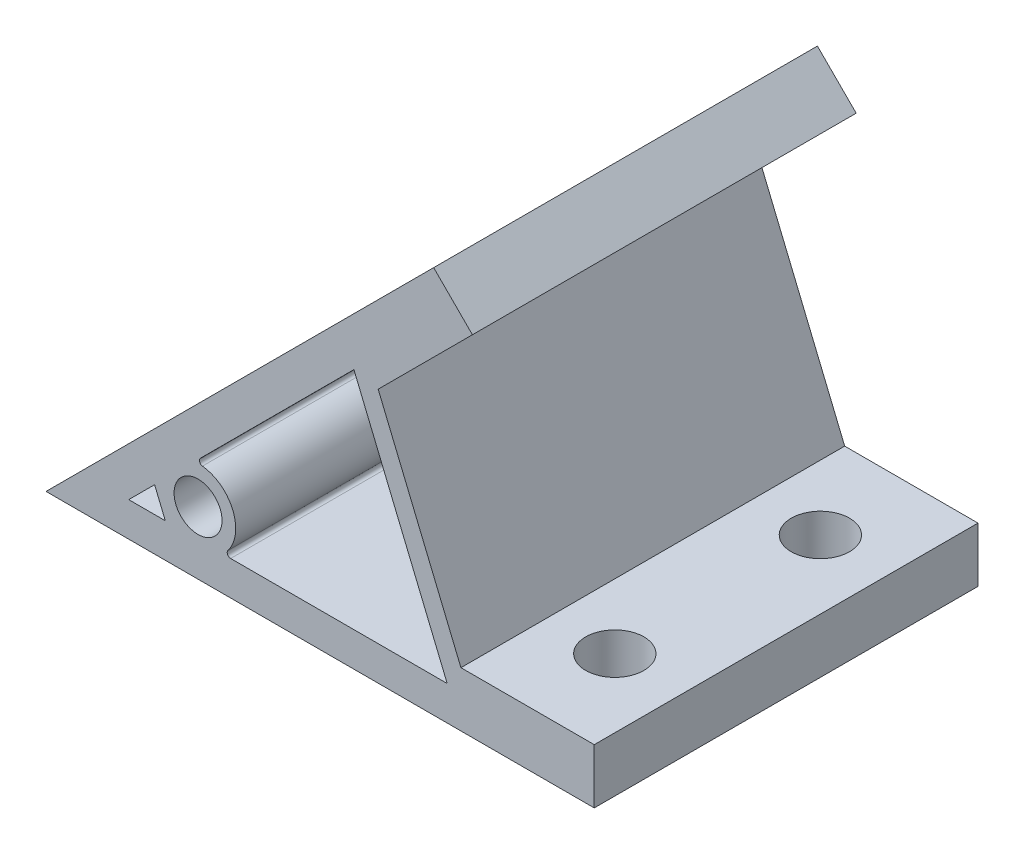
ISO-10303-21;
HEADER;
FILE_DESCRIPTION(('STEP AP214'),'2;1');
FILE_NAME('part.step','',(''),(''),'','','');
FILE_SCHEMA(('AUTOMOTIVE_DESIGN { 1 0 10303 214 1 1 1 1 }'));
ENDSEC;
DATA;
#1=APPLICATION_CONTEXT('core data for automotive mechanical design processes');
#2=APPLICATION_PROTOCOL_DEFINITION('international standard','automotive_design',2000,#1);
#3=PRODUCT_CONTEXT('',#1,'mechanical');
#4=PRODUCT('Part','Part','',(#3));
#5=PRODUCT_RELATED_PRODUCT_CATEGORY('part','',(#4));
#6=PRODUCT_DEFINITION_FORMATION('','',#4);
#7=PRODUCT_DEFINITION_CONTEXT('part definition',#1,'design');
#8=PRODUCT_DEFINITION('design','',#6,#7);
#9=PRODUCT_DEFINITION_SHAPE('','',#8);
#10=(LENGTH_UNIT() NAMED_UNIT(*) SI_UNIT(.MILLI.,.METRE.));
#11=(NAMED_UNIT(*) PLANE_ANGLE_UNIT() SI_UNIT($,.RADIAN.));
#12=(NAMED_UNIT(*) SI_UNIT($,.STERADIAN.) SOLID_ANGLE_UNIT());
#13=UNCERTAINTY_MEASURE_WITH_UNIT(LENGTH_MEASURE(1.E-05),#10,'distance_accuracy_value','');
#14=(GEOMETRIC_REPRESENTATION_CONTEXT(3) GLOBAL_UNCERTAINTY_ASSIGNED_CONTEXT((#13)) GLOBAL_UNIT_ASSIGNED_CONTEXT((#10,
#11,#12)) REPRESENTATION_CONTEXT('',''));
#15=CARTESIAN_POINT('',(0.,0.,0.));
#16=DIRECTION('',(0.,0.,1.));
#17=DIRECTION('',(1.,0.,0.));
#18=AXIS2_PLACEMENT_3D('',#15,#16,#17);
#19=CARTESIAN_POINT('',(48.4703535180654,37.1566450190806,28.));
#20=DIRECTION('',(-0.707106781186548,0.707106781186547,0.));
#21=DIRECTION('',(-0.707106781186547,-0.707106781186548,0.));
#22=AXIS2_PLACEMENT_3D('',#19,#20,#21);
#23=PLANE('',#22);
#24=CARTESIAN_POINT('',(55.1543289325507,43.840620433566,15.));
#25=DIRECTION('',(-0.707106781186548,0.707106781186547,0.));
#26=DIRECTION('',(-0.707106781186547,-0.707106781186548,0.));
#27=AXIS2_PLACEMENT_3D('',#24,#25,#26);
#28=CIRCLE('',#27,4.25);
#29=CARTESIAN_POINT('',(52.1491251125079,40.8354166135231,15.));
#30=VERTEX_POINT('',#29);
#31=EDGE_CURVE('E289',#30,#30,#28,.F.);
#32=ORIENTED_EDGE('',*,*,#31,.F.);
#33=EDGE_LOOP('',(#32));
#34=FACE_BOUND('',#33,.T.);
#35=DIRECTION('',(0.707106781186547,0.707106781186548,0.));
#36=VECTOR('',#35,1.);
#37=CARTESIAN_POINT('',(48.4703535180654,37.1566450190806,-28.));
#38=LINE('',#37,#36);
#39=CARTESIAN_POINT('',(48.4703535180654,37.1566450190806,-28.));
#40=VERTEX_POINT('',#39);
#41=CARTESIAN_POINT('',(62.2253967444162,50.9116882454314,-28.));
#42=VERTEX_POINT('',#41);
#43=EDGE_CURVE('E257',#40,#42,#38,.T.);
#44=ORIENTED_EDGE('',*,*,#43,.T.);
#45=DIRECTION('',(0.,0.,-1.));
#46=VECTOR('',#45,1.);
#47=CARTESIAN_POINT('',(62.2253967444162,50.9116882454314,28.));
#48=LINE('',#47,#46);
#49=CARTESIAN_POINT('',(62.2253967444162,50.9116882454314,28.));
#50=VERTEX_POINT('',#49);
#51=EDGE_CURVE('E267',#50,#42,#48,.T.);
#52=ORIENTED_EDGE('',*,*,#51,.F.);
#53=DIRECTION('',(0.707106781186547,0.707106781186548,0.));
#54=VECTOR('',#53,1.);
#55=CARTESIAN_POINT('',(48.4703535180654,37.1566450190806,28.));
#56=LINE('',#55,#54);
#57=CARTESIAN_POINT('',(48.4703535180654,37.1566450190806,28.));
#58=VERTEX_POINT('',#57);
#59=EDGE_CURVE('E242',#58,#50,#56,.T.);
#60=ORIENTED_EDGE('',*,*,#59,.F.);
#61=DIRECTION('',(0.,0.,-1.));
#62=VECTOR('',#61,1.);
#63=CARTESIAN_POINT('',(48.4703535180654,37.1566450190806,28.));
#64=LINE('',#63,#62);
#65=EDGE_CURVE('E270',#58,#40,#64,.T.);
#66=ORIENTED_EDGE('',*,*,#65,.T.);
#67=EDGE_LOOP('',(#44,#52,#60,#66));
#68=FACE_BOUND('',#67,.T.);
#69=CARTESIAN_POINT('',(55.1543289325507,43.840620433566,-15.));
#70=DIRECTION('',(-0.707106781186548,0.707106781186547,0.));
#71=DIRECTION('',(-0.707106781186547,-0.707106781186548,0.));
#72=AXIS2_PLACEMENT_3D('',#69,#70,#71);
#73=CIRCLE('',#72,4.25000000000001);
#74=CARTESIAN_POINT('',(52.1491251125079,40.8354166135231,-15.));
#75=VERTEX_POINT('',#74);
#76=EDGE_CURVE('E295',#75,#75,#73,.F.);
#77=ORIENTED_EDGE('',*,*,#76,.F.);
#78=EDGE_LOOP('',(#77));
#79=FACE_BOUND('',#78,.T.);
#80=ADVANCED_FACE('F33',(#34,#68,#79),#23,.F.);
#81=CARTESIAN_POINT('',(0.,0.,28.));
#82=DIRECTION('',(0.707106781186549,-0.707106781186546,0.));
#83=DIRECTION('',(0.707106781186546,0.707106781186549,0.));
#84=AXIS2_PLACEMENT_3D('',#81,#82,#83);
#85=PLANE('',#84);
#86=CARTESIAN_POINT('',(49.4974746830583,49.4974746830584,15.));
#87=DIRECTION('',(0.707106781186548,-0.707106781186547,0.));
#88=DIRECTION('',(0.,0.,-1.));
#89=AXIS2_PLACEMENT_3D('',#86,#87,#88);
#90=CIRCLE('',#89,4.25);
#91=CARTESIAN_POINT('',(49.4974746830583,49.4974746830584,10.75));
#92=VERTEX_POINT('',#91);
#93=EDGE_CURVE('E292',#92,#92,#90,.T.);
#94=ORIENTED_EDGE('',*,*,#93,.T.);
#95=EDGE_LOOP('',(#94));
#96=FACE_BOUND('',#95,.T.);
#97=DIRECTION('',(-0.707106781186546,-0.707106781186549,0.));
#98=VECTOR('',#97,1.);
#99=CARTESIAN_POINT('',(0.,0.,-28.));
#100=LINE('',#99,#98);
#101=CARTESIAN_POINT('',(56.5685424949237,56.5685424949239,-28.));
#102=VERTEX_POINT('',#101);
#103=CARTESIAN_POINT('',(0.,0.,-28.));
#104=VERTEX_POINT('',#103);
#105=EDGE_CURVE('E236',#102,#104,#100,.T.);
#106=ORIENTED_EDGE('',*,*,#105,.T.);
#107=DIRECTION('',(0.,0.,-1.));
#108=VECTOR('',#107,1.);
#109=CARTESIAN_POINT('',(0.,0.,28.));
#110=LINE('',#109,#108);
#111=CARTESIAN_POINT('',(0.,0.,28.));
#112=VERTEX_POINT('',#111);
#113=EDGE_CURVE('E248',#112,#104,#110,.T.);
#114=ORIENTED_EDGE('',*,*,#113,.F.);
#115=DIRECTION('',(-0.707106781186546,-0.707106781186549,0.));
#116=VECTOR('',#115,1.);
#117=CARTESIAN_POINT('',(0.,0.,28.));
#118=LINE('',#117,#116);
#119=CARTESIAN_POINT('',(56.5685424949237,56.5685424949239,28.));
#120=VERTEX_POINT('',#119);
#121=EDGE_CURVE('E246',#120,#112,#118,.T.);
#122=ORIENTED_EDGE('',*,*,#121,.F.);
#123=DIRECTION('',(0.,0.,-1.));
#124=VECTOR('',#123,1.);
#125=CARTESIAN_POINT('',(56.5685424949237,56.5685424949239,28.));
#126=LINE('',#125,#124);
#127=EDGE_CURVE('E264',#120,#102,#126,.T.);
#128=ORIENTED_EDGE('',*,*,#127,.T.);
#129=EDGE_LOOP('',(#106,#114,#122,#128));
#130=FACE_BOUND('',#129,.T.);
#131=CARTESIAN_POINT('',(49.4974746830583,49.4974746830584,-15.));
#132=DIRECTION('',(0.707106781186548,-0.707106781186547,0.));
#133=DIRECTION('',(0.,0.,1.));
#134=AXIS2_PLACEMENT_3D('',#131,#132,#133);
#135=CIRCLE('',#134,4.25000000000001);
#136=CARTESIAN_POINT('',(49.4974746830583,49.4974746830584,-10.75));
#137=VERTEX_POINT('',#136);
#138=EDGE_CURVE('E298',#137,#137,#135,.T.);
#139=ORIENTED_EDGE('',*,*,#138,.T.);
#140=EDGE_LOOP('',(#139));
#141=FACE_BOUND('',#140,.T.);
#142=ADVANCED_FACE('F302',(#96,#130,#141),#85,.F.);
#143=CARTESIAN_POINT('',(80.,0.,28.));
#144=DIRECTION('',(0.,0.,1.));
#145=DIRECTION('',(1.,0.,0.));
#146=AXIS2_PLACEMENT_3D('',#143,#144,#145);
#147=PLANE('',#146);
#148=CARTESIAN_POINT('',(22.1846771867485,9.15647377294881,28.));
#149=DIRECTION('',(0.,0.,1.));
#150=DIRECTION('',(1.,0.,0.));
#151=AXIS2_PLACEMENT_3D('',#148,#149,#150);
#152=CIRCLE('',#151,3.5);
#153=CARTESIAN_POINT('',(25.6846771867485,9.15647377294881,28.));
#154=VERTEX_POINT('',#153);
#155=EDGE_CURVE('E202',#154,#154,#152,.T.);
#156=ORIENTED_EDGE('',*,*,#155,.F.);
#157=EDGE_LOOP('',(#156));
#158=FACE_BOUND('',#157,.T.);
#159=DIRECTION('',(1.,0.,0.));
#160=VECTOR('',#159,1.);
#161=CARTESIAN_POINT('',(0.,0.,28.));
#162=LINE('',#161,#160);
#163=CARTESIAN_POINT('',(80.,0.,28.));
#164=VERTEX_POINT('',#163);
#165=EDGE_CURVE('E232',#112,#164,#162,.T.);
#166=ORIENTED_EDGE('',*,*,#165,.T.);
#167=DIRECTION('',(0.,1.,0.));
#168=VECTOR('',#167,1.);
#169=CARTESIAN_POINT('',(80.,0.,28.));
#170=LINE('',#169,#168);
#171=CARTESIAN_POINT('',(80.,8.,28.));
#172=VERTEX_POINT('',#171);
#173=EDGE_CURVE('E235',#164,#172,#170,.T.);
#174=ORIENTED_EDGE('',*,*,#173,.T.);
#175=DIRECTION('',(-1.,0.,0.));
#176=VECTOR('',#175,1.);
#177=CARTESIAN_POINT('',(60.5474313182664,8.,28.));
#178=LINE('',#177,#176);
#179=CARTESIAN_POINT('',(60.5474313182664,8.,28.));
#180=VERTEX_POINT('',#179);
#181=EDGE_CURVE('E238',#172,#180,#178,.T.);
#182=ORIENTED_EDGE('',*,*,#181,.T.);
#183=DIRECTION('',(-0.382683432365087,0.923879532511288,0.));
#184=VECTOR('',#183,1.);
#185=CARTESIAN_POINT('',(60.5474313182664,8.,28.));
#186=LINE('',#185,#184);
#187=EDGE_CURVE('E240',#180,#58,#186,.T.);
#188=ORIENTED_EDGE('',*,*,#187,.T.);
#189=ORIENTED_EDGE('',*,*,#59,.T.);
#190=DIRECTION('',(-0.707106781186549,0.707106781186546,0.));
#191=VECTOR('',#190,1.);
#192=CARTESIAN_POINT('',(62.2253967444162,50.9116882454314,28.));
#193=LINE('',#192,#191);
#194=EDGE_CURVE('E244',#50,#120,#193,.T.);
#195=ORIENTED_EDGE('',*,*,#194,.T.);
#196=ORIENTED_EDGE('',*,*,#121,.T.);
#197=EDGE_LOOP('',(#166,#174,#182,#188,#189,#195,#196));
#198=FACE_BOUND('',#197,.T.);
#199=DIRECTION('',(-0.382683432365087,0.923879532511288,0.));
#200=VECTOR('',#199,1.);
#201=CARTESIAN_POINT('',(15.8476713770087,8.77660356514327,28.));
#202=LINE('',#201,#200);
#203=CARTESIAN_POINT('',(17.4119917933976,5.,28.));
#204=VERTEX_POINT('',#203);
#205=CARTESIAN_POINT('',(15.8476713770087,8.77660356514326,28.));
#206=VERTEX_POINT('',#205);
#207=EDGE_CURVE('E210',#204,#206,#202,.T.);
#208=ORIENTED_EDGE('',*,*,#207,.F.);
#209=DIRECTION('',(1.,0.,0.));
#210=VECTOR('',#209,1.);
#211=CARTESIAN_POINT('',(12.0710678118655,5.,28.));
#212=LINE('',#211,#210);
#213=CARTESIAN_POINT('',(12.0710678118655,5.,28.));
#214=VERTEX_POINT('',#213);
#215=EDGE_CURVE('E208',#214,#204,#212,.T.);
#216=ORIENTED_EDGE('',*,*,#215,.F.);
#217=DIRECTION('',(-0.707106781186543,-0.707106781186552,0.));
#218=VECTOR('',#217,1.);
#219=CARTESIAN_POINT('',(12.0710678118655,5.,28.));
#220=LINE('',#219,#218);
#221=EDGE_CURVE('E214',#206,#214,#220,.T.);
#222=ORIENTED_EDGE('',*,*,#221,.F.);
#223=EDGE_LOOP('',(#208,#216,#222));
#224=FACE_BOUND('',#223,.T.);
#225=DIRECTION('',(1.,0.,0.));
#226=VECTOR('',#225,1.);
#227=CARTESIAN_POINT('',(26.9417981172838,5.,28.));
#228=LINE('',#227,#226);
#229=CARTESIAN_POINT('',(26.9417981172838,5.,28.));
#230=VERTEX_POINT('',#229);
#231=CARTESIAN_POINT('',(58.5428954045085,5.,28.));
#232=VERTEX_POINT('',#231);
#233=EDGE_CURVE('E156',#230,#232,#228,.T.);
#234=ORIENTED_EDGE('',*,*,#233,.F.);
#235=CARTESIAN_POINT('',(26.9417981172838,5.5,28.));
#236=DIRECTION('',(0.,0.,1.));
#237=DIRECTION('',(-1.,0.,0.));
#238=AXIS2_PLACEMENT_3D('',#235,#236,#237);
#239=CIRCLE('',#238,0.5);
#240=CARTESIAN_POINT('',(26.5453713730726,5.80470614774571,28.));
#241=VERTEX_POINT('',#240);
#242=EDGE_CURVE('E148',#241,#230,#239,.T.);
#243=ORIENTED_EDGE('',*,*,#242,.F.);
#244=CARTESIAN_POINT('',(22.1846771867485,9.15647377294881,28.));
#245=DIRECTION('',(0.,0.,-1.));
#246=DIRECTION('',(1.,0.,0.));
#247=AXIS2_PLACEMENT_3D('',#244,#245,#246);
#248=CIRCLE('',#247,5.5);
#249=CARTESIAN_POINT('',(22.8337204048437,14.6180434100627,28.));
#250=VERTEX_POINT('',#249);
#251=EDGE_CURVE('E179',#250,#241,#248,.T.);
#252=ORIENTED_EDGE('',*,*,#251,.F.);
#253=CARTESIAN_POINT('',(22.8927243337614,15.1145497407095,28.));
#254=DIRECTION('',(0.,0.,1.));
#255=DIRECTION('',(1.,0.,0.));
#256=AXIS2_PLACEMENT_3D('',#253,#254,#255);
#257=CIRCLE('',#256,0.500000000000001);
#258=CARTESIAN_POINT('',(22.5391709431682,15.4681031313028,28.));
#259=VERTEX_POINT('',#258);
#260=EDGE_CURVE('E177',#259,#250,#257,.T.);
#261=ORIENTED_EDGE('',*,*,#260,.F.);
#262=DIRECTION('',(-0.707106781186546,-0.707106781186549,0.));
#263=VECTOR('',#262,1.);
#264=CARTESIAN_POINT('',(22.5391709431682,15.4681031313028,28.));
#265=LINE('',#264,#263);
#266=CARTESIAN_POINT('',(44.9316122367555,37.8605444248902,28.));
#267=VERTEX_POINT('',#266);
#268=EDGE_CURVE('E172',#267,#259,#265,.T.);
#269=ORIENTED_EDGE('',*,*,#268,.F.);
#270=DIRECTION('',(-0.382683432365087,0.923879532511288,0.));
#271=VECTOR('',#270,1.);
#272=CARTESIAN_POINT('',(58.5428954045085,5.,28.));
#273=LINE('',#272,#271);
#274=EDGE_CURVE('E170',#232,#267,#273,.T.);
#275=ORIENTED_EDGE('',*,*,#274,.F.);
#276=EDGE_LOOP('',(#234,#243,#252,#261,#269,#275));
#277=FACE_BOUND('',#276,.T.);
#278=ADVANCED_FACE('F168',(#158,#198,#224,#277),#147,.T.);
#279=CARTESIAN_POINT('',(80.,0.,-28.));
#280=DIRECTION('',(0.,0.,1.));
#281=DIRECTION('',(1.,0.,0.));
#282=AXIS2_PLACEMENT_3D('',#279,#280,#281);
#283=PLANE('',#282);
#284=CARTESIAN_POINT('',(22.1846771867485,9.15647377294881,-28.));
#285=DIRECTION('',(0.,0.,1.));
#286=DIRECTION('',(1.,0.,0.));
#287=AXIS2_PLACEMENT_3D('',#284,#285,#286);
#288=CIRCLE('',#287,3.5);
#289=CARTESIAN_POINT('',(25.6846771867485,9.15647377294881,-28.));
#290=VERTEX_POINT('',#289);
#291=EDGE_CURVE('E164',#290,#290,#288,.T.);
#292=ORIENTED_EDGE('',*,*,#291,.T.);
#293=EDGE_LOOP('',(#292));
#294=FACE_BOUND('',#293,.T.);
#295=DIRECTION('',(1.,0.,0.));
#296=VECTOR('',#295,1.);
#297=CARTESIAN_POINT('',(0.,0.,-28.));
#298=LINE('',#297,#296);
#299=CARTESIAN_POINT('',(80.,0.,-28.));
#300=VERTEX_POINT('',#299);
#301=EDGE_CURVE('E231',#104,#300,#298,.T.);
#302=ORIENTED_EDGE('',*,*,#301,.F.);
#303=ORIENTED_EDGE('',*,*,#105,.F.);
#304=DIRECTION('',(-0.707106781186549,0.707106781186546,0.));
#305=VECTOR('',#304,1.);
#306=CARTESIAN_POINT('',(62.2253967444162,50.9116882454314,-28.));
#307=LINE('',#306,#305);
#308=EDGE_CURVE('E259',#42,#102,#307,.T.);
#309=ORIENTED_EDGE('',*,*,#308,.F.);
#310=ORIENTED_EDGE('',*,*,#43,.F.);
#311=DIRECTION('',(-0.382683432365087,0.923879532511288,0.));
#312=VECTOR('',#311,1.);
#313=CARTESIAN_POINT('',(60.5474313182664,8.,-28.));
#314=LINE('',#313,#312);
#315=CARTESIAN_POINT('',(60.5474313182664,8.,-28.));
#316=VERTEX_POINT('',#315);
#317=EDGE_CURVE('E255',#316,#40,#314,.T.);
#318=ORIENTED_EDGE('',*,*,#317,.F.);
#319=DIRECTION('',(-1.,0.,0.));
#320=VECTOR('',#319,1.);
#321=CARTESIAN_POINT('',(60.5474313182664,8.,-28.));
#322=LINE('',#321,#320);
#323=CARTESIAN_POINT('',(80.,8.,-28.));
#324=VERTEX_POINT('',#323);
#325=EDGE_CURVE('E253',#324,#316,#322,.T.);
#326=ORIENTED_EDGE('',*,*,#325,.F.);
#327=DIRECTION('',(0.,1.,0.));
#328=VECTOR('',#327,1.);
#329=CARTESIAN_POINT('',(80.,0.,-28.));
#330=LINE('',#329,#328);
#331=EDGE_CURVE('E251',#300,#324,#330,.T.);
#332=ORIENTED_EDGE('',*,*,#331,.F.);
#333=EDGE_LOOP('',(#302,#303,#309,#310,#318,#326,#332));
#334=FACE_BOUND('',#333,.T.);
#335=DIRECTION('',(1.,0.,0.));
#336=VECTOR('',#335,1.);
#337=CARTESIAN_POINT('',(12.0710678118655,5.,-28.));
#338=LINE('',#337,#336);
#339=CARTESIAN_POINT('',(12.0710678118655,5.,-28.));
#340=VERTEX_POINT('',#339);
#341=CARTESIAN_POINT('',(17.4119917933976,5.,-28.));
#342=VERTEX_POINT('',#341);
#343=EDGE_CURVE('E205',#340,#342,#338,.T.);
#344=ORIENTED_EDGE('',*,*,#343,.T.);
#345=DIRECTION('',(-0.382683432365087,0.923879532511288,0.));
#346=VECTOR('',#345,1.);
#347=CARTESIAN_POINT('',(15.8476713770087,8.77660356514327,-28.));
#348=LINE('',#347,#346);
#349=CARTESIAN_POINT('',(15.8476713770087,8.77660356514327,-28.));
#350=VERTEX_POINT('',#349);
#351=EDGE_CURVE('E219',#342,#350,#348,.T.);
#352=ORIENTED_EDGE('',*,*,#351,.T.);
#353=DIRECTION('',(-0.707106781186543,-0.707106781186552,0.));
#354=VECTOR('',#353,1.);
#355=CARTESIAN_POINT('',(12.0710678118655,5.,-28.));
#356=LINE('',#355,#354);
#357=EDGE_CURVE('E211',#350,#340,#356,.T.);
#358=ORIENTED_EDGE('',*,*,#357,.T.);
#359=EDGE_LOOP('',(#344,#352,#358));
#360=FACE_BOUND('',#359,.T.);
#361=CARTESIAN_POINT('',(26.9417981172838,5.5,-28.));
#362=DIRECTION('',(0.,0.,1.));
#363=DIRECTION('',(-1.,0.,0.));
#364=AXIS2_PLACEMENT_3D('',#361,#362,#363);
#365=CIRCLE('',#364,0.5);
#366=CARTESIAN_POINT('',(26.5453713730726,5.8047061477457,-28.));
#367=VERTEX_POINT('',#366);
#368=CARTESIAN_POINT('',(26.9417981172838,5.,-28.));
#369=VERTEX_POINT('',#368);
#370=EDGE_CURVE('E58',#367,#369,#365,.T.);
#371=ORIENTED_EDGE('',*,*,#370,.T.);
#372=DIRECTION('',(1.,0.,0.));
#373=VECTOR('',#372,1.);
#374=CARTESIAN_POINT('',(26.9417981172838,5.,-28.));
#375=LINE('',#374,#373);
#376=CARTESIAN_POINT('',(58.5428954045085,5.,-28.));
#377=VERTEX_POINT('',#376);
#378=EDGE_CURVE('E163',#369,#377,#375,.T.);
#379=ORIENTED_EDGE('',*,*,#378,.T.);
#380=DIRECTION('',(-0.382683432365087,0.923879532511288,0.));
#381=VECTOR('',#380,1.);
#382=CARTESIAN_POINT('',(58.5428954045085,5.,-28.));
#383=LINE('',#382,#381);
#384=CARTESIAN_POINT('',(44.9316122367555,37.8605444248902,-28.));
#385=VERTEX_POINT('',#384);
#386=EDGE_CURVE('E184',#377,#385,#383,.T.);
#387=ORIENTED_EDGE('',*,*,#386,.T.);
#388=DIRECTION('',(-0.707106781186546,-0.707106781186549,0.));
#389=VECTOR('',#388,1.);
#390=CARTESIAN_POINT('',(22.5391709431682,15.4681031313028,-28.));
#391=LINE('',#390,#389);
#392=CARTESIAN_POINT('',(22.5391709431682,15.4681031313028,-28.));
#393=VERTEX_POINT('',#392);
#394=EDGE_CURVE('E187',#385,#393,#391,.T.);
#395=ORIENTED_EDGE('',*,*,#394,.T.);
#396=CARTESIAN_POINT('',(22.8927243337614,15.1145497407095,-28.));
#397=DIRECTION('',(0.,0.,1.));
#398=DIRECTION('',(1.,0.,0.));
#399=AXIS2_PLACEMENT_3D('',#396,#397,#398);
#400=CIRCLE('',#399,0.500000000000001);
#401=CARTESIAN_POINT('',(22.8337204048437,14.6180434100628,-28.));
#402=VERTEX_POINT('',#401);
#403=EDGE_CURVE('E190',#393,#402,#400,.T.);
#404=ORIENTED_EDGE('',*,*,#403,.T.);
#405=CARTESIAN_POINT('',(22.1846771867485,9.15647377294881,-28.));
#406=DIRECTION('',(0.,0.,-1.));
#407=DIRECTION('',(1.,0.,0.));
#408=AXIS2_PLACEMENT_3D('',#405,#406,#407);
#409=CIRCLE('',#408,5.5);
#410=EDGE_CURVE('E157',#402,#367,#409,.T.);
#411=ORIENTED_EDGE('',*,*,#410,.T.);
#412=EDGE_LOOP('',(#371,#379,#387,#395,#404,#411));
#413=FACE_BOUND('',#412,.T.);
#414=ADVANCED_FACE('F337',(#294,#334,#360,#413),#283,.F.);
#415=CARTESIAN_POINT('',(0.,0.,28.));
#416=DIRECTION('',(0.,1.,0.));
#417=DIRECTION('',(0.,0.,1.));
#418=AXIS2_PLACEMENT_3D('',#415,#416,#417);
#419=PLANE('',#418);
#420=CARTESIAN_POINT('',(70.,0.,-15.));
#421=DIRECTION('',(0.,-1.,0.));
#422=DIRECTION('',(0.,0.,1.));
#423=AXIS2_PLACEMENT_3D('',#420,#421,#422);
#424=CIRCLE('',#423,4.25000000000001);
#425=CARTESIAN_POINT('',(70.,0.,-10.75));
#426=VERTEX_POINT('',#425);
#427=EDGE_CURVE('E285',#426,#426,#424,.T.);
#428=ORIENTED_EDGE('',*,*,#427,.F.);
#429=EDGE_LOOP('',(#428));
#430=FACE_BOUND('',#429,.T.);
#431=CARTESIAN_POINT('',(70.,0.,15.));
#432=DIRECTION('',(0.,-1.,0.));
#433=DIRECTION('',(0.,0.,-1.));
#434=AXIS2_PLACEMENT_3D('',#431,#432,#433);
#435=CIRCLE('',#434,4.25);
#436=CARTESIAN_POINT('',(70.,0.,10.75));
#437=VERTEX_POINT('',#436);
#438=EDGE_CURVE('E278',#437,#437,#435,.T.);
#439=ORIENTED_EDGE('',*,*,#438,.F.);
#440=EDGE_LOOP('',(#439));
#441=FACE_BOUND('',#440,.T.);
#442=ORIENTED_EDGE('',*,*,#301,.T.);
#443=DIRECTION('',(0.,0.,-1.));
#444=VECTOR('',#443,1.);
#445=CARTESIAN_POINT('',(80.,0.,28.));
#446=LINE('',#445,#444);
#447=EDGE_CURVE('E11',#164,#300,#446,.T.);
#448=ORIENTED_EDGE('',*,*,#447,.F.);
#449=ORIENTED_EDGE('',*,*,#165,.F.);
#450=ORIENTED_EDGE('',*,*,#113,.T.);
#451=EDGE_LOOP('',(#442,#448,#449,#450));
#452=FACE_BOUND('',#451,.T.);
#453=ADVANCED_FACE('F35',(#430,#441,#452),#419,.F.);
#454=CARTESIAN_POINT('',(80.,0.,28.));
#455=DIRECTION('',(-1.,0.,0.));
#456=DIRECTION('',(0.,0.,1.));
#457=AXIS2_PLACEMENT_3D('',#454,#455,#456);
#458=PLANE('',#457);
#459=ORIENTED_EDGE('',*,*,#331,.T.);
#460=DIRECTION('',(0.,0.,-1.));
#461=VECTOR('',#460,1.);
#462=CARTESIAN_POINT('',(80.,8.,28.));
#463=LINE('',#462,#461);
#464=EDGE_CURVE('E42',#172,#324,#463,.T.);
#465=ORIENTED_EDGE('',*,*,#464,.F.);
#466=ORIENTED_EDGE('',*,*,#173,.F.);
#467=ORIENTED_EDGE('',*,*,#447,.T.);
#468=EDGE_LOOP('',(#459,#465,#466,#467));
#469=FACE_BOUND('',#468,.T.);
#470=ADVANCED_FACE('F330',(#469),#458,.F.);
#471=CARTESIAN_POINT('',(60.5474313182664,8.,28.));
#472=DIRECTION('',(0.,-1.,0.));
#473=DIRECTION('',(0.,0.,-1.));
#474=AXIS2_PLACEMENT_3D('',#471,#472,#473);
#475=PLANE('',#474);
#476=CARTESIAN_POINT('',(70.,8.,-15.));
#477=DIRECTION('',(0.,-1.,0.));
#478=DIRECTION('',(0.,0.,-1.));
#479=AXIS2_PLACEMENT_3D('',#476,#477,#478);
#480=CIRCLE('',#479,4.25000000000001);
#481=CARTESIAN_POINT('',(70.,8.,-19.25));
#482=VERTEX_POINT('',#481);
#483=EDGE_CURVE('E37',#482,#482,#480,.T.);
#484=ORIENTED_EDGE('',*,*,#483,.T.);
#485=EDGE_LOOP('',(#484));
#486=FACE_BOUND('',#485,.T.);
#487=CARTESIAN_POINT('',(70.,8.,15.));
#488=DIRECTION('',(0.,-1.,0.));
#489=DIRECTION('',(0.,0.,-1.));
#490=AXIS2_PLACEMENT_3D('',#487,#488,#489);
#491=CIRCLE('',#490,4.25);
#492=CARTESIAN_POINT('',(70.,8.,10.75));
#493=VERTEX_POINT('',#492);
#494=EDGE_CURVE('E182',#493,#493,#491,.T.);
#495=ORIENTED_EDGE('',*,*,#494,.T.);
#496=EDGE_LOOP('',(#495));
#497=FACE_BOUND('',#496,.T.);
#498=ORIENTED_EDGE('',*,*,#325,.T.);
#499=DIRECTION('',(0.,0.,-1.));
#500=VECTOR('',#499,1.);
#501=CARTESIAN_POINT('',(60.5474313182664,8.,28.));
#502=LINE('',#501,#500);
#503=EDGE_CURVE('E273',#180,#316,#502,.T.);
#504=ORIENTED_EDGE('',*,*,#503,.F.);
#505=ORIENTED_EDGE('',*,*,#181,.F.);
#506=ORIENTED_EDGE('',*,*,#464,.T.);
#507=EDGE_LOOP('',(#498,#504,#505,#506));
#508=FACE_BOUND('',#507,.T.);
#509=ADVANCED_FACE('F327',(#486,#497,#508),#475,.F.);
#510=CARTESIAN_POINT('',(60.5474313182664,8.,28.));
#511=DIRECTION('',(-0.923879532511288,-0.382683432365087,0.));
#512=DIRECTION('',(0.382683432365087,-0.923879532511288,0.));
#513=AXIS2_PLACEMENT_3D('',#510,#511,#512);
#514=PLANE('',#513);
#515=ORIENTED_EDGE('',*,*,#317,.T.);
#516=ORIENTED_EDGE('',*,*,#65,.F.);
#517=ORIENTED_EDGE('',*,*,#187,.F.);
#518=ORIENTED_EDGE('',*,*,#503,.T.);
#519=EDGE_LOOP('',(#515,#516,#517,#518));
#520=FACE_BOUND('',#519,.T.);
#521=ADVANCED_FACE('F324',(#520),#514,.F.);
#522=CARTESIAN_POINT('',(62.2253967444162,50.9116882454314,28.));
#523=DIRECTION('',(-0.707106781186546,-0.707106781186549,0.));
#524=DIRECTION('',(0.707106781186549,-0.707106781186546,0.));
#525=AXIS2_PLACEMENT_3D('',#522,#523,#524);
#526=PLANE('',#525);
#527=ORIENTED_EDGE('',*,*,#308,.T.);
#528=ORIENTED_EDGE('',*,*,#127,.F.);
#529=ORIENTED_EDGE('',*,*,#194,.F.);
#530=ORIENTED_EDGE('',*,*,#51,.T.);
#531=EDGE_LOOP('',(#527,#528,#529,#530));
#532=FACE_BOUND('',#531,.T.);
#533=ADVANCED_FACE('F323',(#532),#526,.F.);
#534=CARTESIAN_POINT('',(12.0710678118655,5.,28.));
#535=DIRECTION('',(0.,1.,0.));
#536=DIRECTION('',(0.,0.,1.));
#537=AXIS2_PLACEMENT_3D('',#534,#535,#536);
#538=PLANE('',#537);
#539=ORIENTED_EDGE('',*,*,#343,.F.);
#540=DIRECTION('',(0.,0.,-1.));
#541=VECTOR('',#540,1.);
#542=CARTESIAN_POINT('',(12.0710678118655,5.,28.));
#543=LINE('',#542,#541);
#544=EDGE_CURVE('E216',#214,#340,#543,.T.);
#545=ORIENTED_EDGE('',*,*,#544,.F.);
#546=ORIENTED_EDGE('',*,*,#215,.T.);
#547=DIRECTION('',(0.,0.,-1.));
#548=VECTOR('',#547,1.);
#549=CARTESIAN_POINT('',(17.4119917933976,5.,28.));
#550=LINE('',#549,#548);
#551=EDGE_CURVE('E228',#204,#342,#550,.T.);
#552=ORIENTED_EDGE('',*,*,#551,.T.);
#553=EDGE_LOOP('',(#539,#545,#546,#552));
#554=FACE_BOUND('',#553,.T.);
#555=ADVANCED_FACE('F367',(#554),#538,.T.);
#556=CARTESIAN_POINT('',(15.8476713770087,8.77660356514327,28.));
#557=DIRECTION('',(-0.923879532511288,-0.382683432365087,0.));
#558=DIRECTION('',(0.382683432365087,-0.923879532511288,0.));
#559=AXIS2_PLACEMENT_3D('',#556,#557,#558);
#560=PLANE('',#559);
#561=ORIENTED_EDGE('',*,*,#351,.F.);
#562=ORIENTED_EDGE('',*,*,#551,.F.);
#563=ORIENTED_EDGE('',*,*,#207,.T.);
#564=DIRECTION('',(0.,0.,-1.));
#565=VECTOR('',#564,1.);
#566=CARTESIAN_POINT('',(15.8476713770087,8.77660356514327,28.));
#567=LINE('',#566,#565);
#568=EDGE_CURVE('E226',#206,#350,#567,.T.);
#569=ORIENTED_EDGE('',*,*,#568,.T.);
#570=EDGE_LOOP('',(#561,#562,#563,#569));
#571=FACE_BOUND('',#570,.T.);
#572=ADVANCED_FACE('F371',(#571),#560,.T.);
#573=CARTESIAN_POINT('',(12.0710678118655,5.,28.));
#574=DIRECTION('',(0.707106781186552,-0.707106781186543,0.));
#575=DIRECTION('',(0.707106781186543,0.707106781186552,0.));
#576=AXIS2_PLACEMENT_3D('',#573,#574,#575);
#577=PLANE('',#576);
#578=ORIENTED_EDGE('',*,*,#357,.F.);
#579=ORIENTED_EDGE('',*,*,#568,.F.);
#580=ORIENTED_EDGE('',*,*,#221,.T.);
#581=ORIENTED_EDGE('',*,*,#544,.T.);
#582=EDGE_LOOP('',(#578,#579,#580,#581));
#583=FACE_BOUND('',#582,.T.);
#584=ADVANCED_FACE('F377',(#583),#577,.T.);
#585=CARTESIAN_POINT('',(22.1846771867485,9.15647377294881,28.));
#586=DIRECTION('',(0.,0.,-1.));
#587=DIRECTION('',(-1.,0.,0.));
#588=AXIS2_PLACEMENT_3D('',#585,#586,#587);
#589=CYLINDRICAL_SURFACE('',#588,3.5);
#590=ORIENTED_EDGE('',*,*,#155,.T.);
#591=EDGE_LOOP('',(#590));
#592=FACE_BOUND('',#591,.T.);
#593=ORIENTED_EDGE('',*,*,#291,.F.);
#594=EDGE_LOOP('',(#593));
#595=FACE_BOUND('',#594,.T.);
#596=ADVANCED_FACE('F391',(#592,#595),#589,.F.);
#597=CARTESIAN_POINT('',(26.9417981172838,5.5,28.));
#598=DIRECTION('',(0.,0.,-1.));
#599=DIRECTION('',(-1.,0.,0.));
#600=AXIS2_PLACEMENT_3D('',#597,#598,#599);
#601=CYLINDRICAL_SURFACE('',#600,0.5);
#602=ORIENTED_EDGE('',*,*,#370,.F.);
#603=DIRECTION('',(0.,0.,-1.));
#604=VECTOR('',#603,1.);
#605=CARTESIAN_POINT('',(26.5453713730726,5.80470614774571,28.));
#606=LINE('',#605,#604);
#607=EDGE_CURVE('E152',#241,#367,#606,.T.);
#608=ORIENTED_EDGE('',*,*,#607,.F.);
#609=ORIENTED_EDGE('',*,*,#242,.T.);
#610=DIRECTION('',(0.,0.,-1.));
#611=VECTOR('',#610,1.);
#612=CARTESIAN_POINT('',(26.9417981172838,5.,28.));
#613=LINE('',#612,#611);
#614=EDGE_CURVE('E151',#230,#369,#613,.T.);
#615=ORIENTED_EDGE('',*,*,#614,.T.);
#616=EDGE_LOOP('',(#602,#608,#609,#615));
#617=FACE_BOUND('',#616,.T.);
#618=ADVANCED_FACE('F150',(#617),#601,.F.);
#619=CARTESIAN_POINT('',(26.9417981172838,5.,28.));
#620=DIRECTION('',(0.,1.,0.));
#621=DIRECTION('',(-1.,0.,0.));
#622=AXIS2_PLACEMENT_3D('',#619,#620,#621);
#623=PLANE('',#622);
#624=ORIENTED_EDGE('',*,*,#378,.F.);
#625=ORIENTED_EDGE('',*,*,#614,.F.);
#626=ORIENTED_EDGE('',*,*,#233,.T.);
#627=DIRECTION('',(0.,0.,-1.));
#628=VECTOR('',#627,1.);
#629=CARTESIAN_POINT('',(58.5428954045085,5.,28.));
#630=LINE('',#629,#628);
#631=EDGE_CURVE('E165',#232,#377,#630,.T.);
#632=ORIENTED_EDGE('',*,*,#631,.T.);
#633=EDGE_LOOP('',(#624,#625,#626,#632));
#634=FACE_BOUND('',#633,.T.);
#635=ADVANCED_FACE('F160',(#634),#623,.T.);
#636=CARTESIAN_POINT('',(58.5428954045085,5.,28.));
#637=DIRECTION('',(-0.923879532511288,-0.382683432365087,0.));
#638=DIRECTION('',(0.382683432365087,-0.923879532511288,0.));
#639=AXIS2_PLACEMENT_3D('',#636,#637,#638);
#640=PLANE('',#639);
#641=ORIENTED_EDGE('',*,*,#386,.F.);
#642=ORIENTED_EDGE('',*,*,#631,.F.);
#643=ORIENTED_EDGE('',*,*,#274,.T.);
#644=DIRECTION('',(0.,0.,-1.));
#645=VECTOR('',#644,1.);
#646=CARTESIAN_POINT('',(44.9316122367555,37.8605444248902,28.));
#647=LINE('',#646,#645);
#648=EDGE_CURVE('E199',#267,#385,#647,.T.);
#649=ORIENTED_EDGE('',*,*,#648,.T.);
#650=EDGE_LOOP('',(#641,#642,#643,#649));
#651=FACE_BOUND('',#650,.T.);
#652=ADVANCED_FACE('F404',(#651),#640,.T.);
#653=CARTESIAN_POINT('',(22.5391709431682,15.4681031313028,28.));
#654=DIRECTION('',(0.707106781186549,-0.707106781186546,0.));
#655=DIRECTION('',(0.707106781186546,0.707106781186549,0.));
#656=AXIS2_PLACEMENT_3D('',#653,#654,#655);
#657=PLANE('',#656);
#658=ORIENTED_EDGE('',*,*,#394,.F.);
#659=ORIENTED_EDGE('',*,*,#648,.F.);
#660=ORIENTED_EDGE('',*,*,#268,.T.);
#661=DIRECTION('',(0.,0.,-1.));
#662=VECTOR('',#661,1.);
#663=CARTESIAN_POINT('',(22.5391709431682,15.4681031313028,28.));
#664=LINE('',#663,#662);
#665=EDGE_CURVE('E197',#259,#393,#664,.T.);
#666=ORIENTED_EDGE('',*,*,#665,.T.);
#667=EDGE_LOOP('',(#658,#659,#660,#666));
#668=FACE_BOUND('',#667,.T.);
#669=ADVANCED_FACE('F407',(#668),#657,.T.);
#670=CARTESIAN_POINT('',(22.8927243337614,15.1145497407095,28.));
#671=DIRECTION('',(0.,0.,-1.));
#672=DIRECTION('',(-1.,0.,0.));
#673=AXIS2_PLACEMENT_3D('',#670,#671,#672);
#674=CYLINDRICAL_SURFACE('',#673,0.500000000000001);
#675=ORIENTED_EDGE('',*,*,#403,.F.);
#676=ORIENTED_EDGE('',*,*,#665,.F.);
#677=ORIENTED_EDGE('',*,*,#260,.T.);
#678=DIRECTION('',(0.,0.,-1.));
#679=VECTOR('',#678,1.);
#680=CARTESIAN_POINT('',(22.8337204048437,14.6180434100628,28.));
#681=LINE('',#680,#679);
#682=EDGE_CURVE('E50',#250,#402,#681,.T.);
#683=ORIENTED_EDGE('',*,*,#682,.T.);
#684=EDGE_LOOP('',(#675,#676,#677,#683));
#685=FACE_BOUND('',#684,.T.);
#686=ADVANCED_FACE('F411',(#685),#674,.F.);
#687=CARTESIAN_POINT('',(22.1846771867485,9.15647377294881,28.));
#688=DIRECTION('',(0.,0.,-1.));
#689=DIRECTION('',(-1.,0.,0.));
#690=AXIS2_PLACEMENT_3D('',#687,#688,#689);
#691=CYLINDRICAL_SURFACE('',#690,5.5);
#692=ORIENTED_EDGE('',*,*,#410,.F.);
#693=ORIENTED_EDGE('',*,*,#682,.F.);
#694=ORIENTED_EDGE('',*,*,#251,.T.);
#695=ORIENTED_EDGE('',*,*,#607,.T.);
#696=EDGE_LOOP('',(#692,#693,#694,#695));
#697=FACE_BOUND('',#696,.T.);
#698=ADVANCED_FACE('F415',(#697),#691,.T.);
#699=CARTESIAN_POINT('',(70.,20.,15.));
#700=DIRECTION('',(0.,-1.,0.));
#701=DIRECTION('',(0.,0.,-1.));
#702=AXIS2_PLACEMENT_3D('',#699,#700,#701);
#703=CYLINDRICAL_SURFACE('',#702,4.25);
#704=ORIENTED_EDGE('',*,*,#438,.T.);
#705=EDGE_LOOP('',(#704));
#706=FACE_BOUND('',#705,.T.);
#707=ORIENTED_EDGE('',*,*,#494,.F.);
#708=EDGE_LOOP('',(#707));
#709=FACE_BOUND('',#708,.T.);
#710=ADVANCED_FACE('F419',(#706,#709),#703,.F.);
#711=CARTESIAN_POINT('',(70.,20.,-15.));
#712=DIRECTION('',(0.,-1.,0.));
#713=DIRECTION('',(0.,0.,-1.));
#714=AXIS2_PLACEMENT_3D('',#711,#712,#713);
#715=CYLINDRICAL_SURFACE('',#714,4.25000000000001);
#716=ORIENTED_EDGE('',*,*,#427,.T.);
#717=EDGE_LOOP('',(#716));
#718=FACE_BOUND('',#717,.T.);
#719=ORIENTED_EDGE('',*,*,#483,.F.);
#720=EDGE_LOOP('',(#719));
#721=FACE_BOUND('',#720,.T.);
#722=ADVANCED_FACE('F422',(#718,#721),#715,.F.);
#723=CARTESIAN_POINT('',(63.6396103067892,35.3553390593275,15.));
#724=DIRECTION('',(-0.707106781186548,0.707106781186547,0.));
#725=DIRECTION('',(-0.707106781186547,-0.707106781186548,0.));
#726=AXIS2_PLACEMENT_3D('',#723,#724,#725);
#727=CYLINDRICAL_SURFACE('',#726,4.25);
#728=ORIENTED_EDGE('',*,*,#93,.F.);
#729=EDGE_LOOP('',(#728));
#730=FACE_BOUND('',#729,.T.);
#731=ORIENTED_EDGE('',*,*,#31,.T.);
#732=EDGE_LOOP('',(#731));
#733=FACE_BOUND('',#732,.T.);
#734=ADVANCED_FACE('F307',(#730,#733),#727,.F.);
#735=CARTESIAN_POINT('',(63.6396103067892,35.3553390593275,-15.));
#736=DIRECTION('',(-0.707106781186548,0.707106781186547,0.));
#737=DIRECTION('',(-0.707106781186547,-0.707106781186548,0.));
#738=AXIS2_PLACEMENT_3D('',#735,#736,#737);
#739=CYLINDRICAL_SURFACE('',#738,4.25000000000001);
#740=ORIENTED_EDGE('',*,*,#138,.F.);
#741=EDGE_LOOP('',(#740));
#742=FACE_BOUND('',#741,.T.);
#743=ORIENTED_EDGE('',*,*,#76,.T.);
#744=EDGE_LOOP('',(#743));
#745=FACE_BOUND('',#744,.T.);
#746=ADVANCED_FACE('F304',(#742,#745),#739,.F.);
#747=CLOSED_SHELL('',(#80,#142,#278,#414,#453,#470,#509,#521,#533,#555,#572,#584,#596,#618,#635,
#652,#669,#686,#698,#710,#722,#734,#746));
#748=MANIFOLD_SOLID_BREP('B2',#747);
#749=ADVANCED_BREP_SHAPE_REPRESENTATION('',(#18,#748),#14);
#750=SHAPE_DEFINITION_REPRESENTATION(#9,#749);
ENDSEC;
END-ISO-10303-21;
